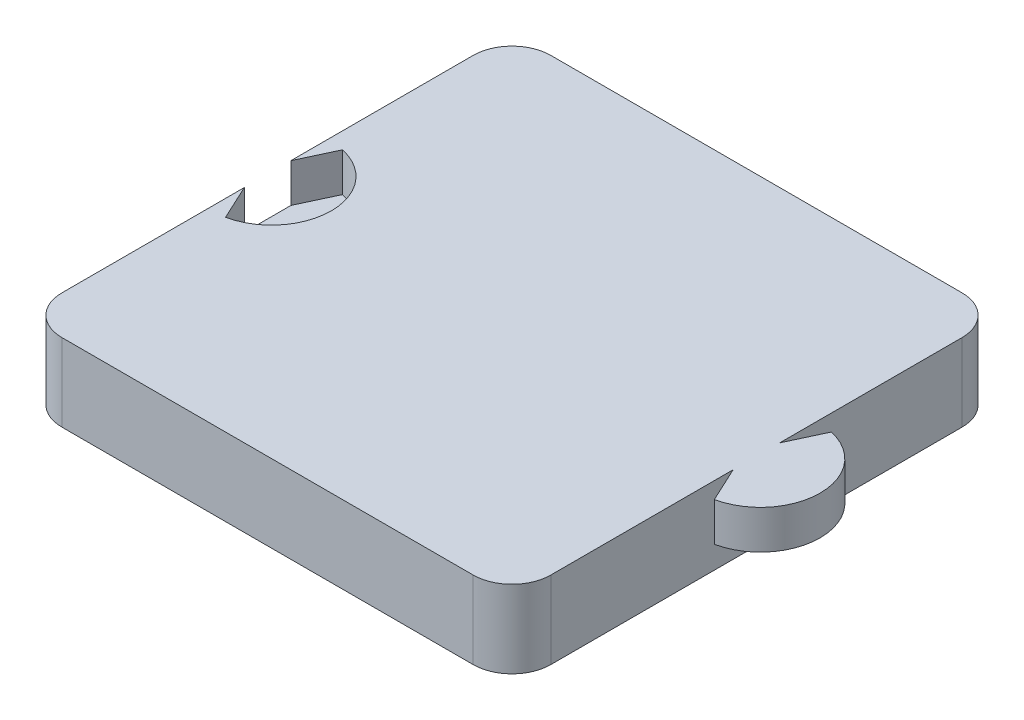
ISO-10303-21;
HEADER;
FILE_DESCRIPTION(('STEP AP214'),'2;1');
FILE_NAME('part.step','',(''),(''),'','','');
FILE_SCHEMA(('AUTOMOTIVE_DESIGN { 1 0 10303 214 1 1 1 1 }'));
ENDSEC;
DATA;
#1=APPLICATION_CONTEXT('core data for automotive mechanical design processes');
#2=APPLICATION_PROTOCOL_DEFINITION('international standard','automotive_design',2000,#1);
#3=PRODUCT_CONTEXT('',#1,'mechanical');
#4=PRODUCT('Part','Part','',(#3));
#5=PRODUCT_RELATED_PRODUCT_CATEGORY('part','',(#4));
#6=PRODUCT_DEFINITION_FORMATION('','',#4);
#7=PRODUCT_DEFINITION_CONTEXT('part definition',#1,'design');
#8=PRODUCT_DEFINITION('design','',#6,#7);
#9=PRODUCT_DEFINITION_SHAPE('','',#8);
#10=(LENGTH_UNIT() NAMED_UNIT(*) SI_UNIT(.MILLI.,.METRE.));
#11=(NAMED_UNIT(*) PLANE_ANGLE_UNIT() SI_UNIT($,.RADIAN.));
#12=(NAMED_UNIT(*) SI_UNIT($,.STERADIAN.) SOLID_ANGLE_UNIT());
#13=UNCERTAINTY_MEASURE_WITH_UNIT(LENGTH_MEASURE(1.E-05),#10,'distance_accuracy_value','');
#14=(GEOMETRIC_REPRESENTATION_CONTEXT(3) GLOBAL_UNCERTAINTY_ASSIGNED_CONTEXT((#13)) GLOBAL_UNIT_ASSIGNED_CONTEXT((#10,
#11,#12)) REPRESENTATION_CONTEXT('',''));
#15=CARTESIAN_POINT('',(0.,0.,0.));
#16=DIRECTION('',(0.,0.,1.));
#17=DIRECTION('',(1.,0.,0.));
#18=AXIS2_PLACEMENT_3D('',#15,#16,#17);
#19=CARTESIAN_POINT('',(-33.655,12.7,-33.655));
#20=DIRECTION('',(0.,-1.,0.));
#21=DIRECTION('',(0.,0.,-1.));
#22=AXIS2_PLACEMENT_3D('',#19,#20,#21);
#23=CYLINDRICAL_SURFACE('',#22,6.35);
#24=CARTESIAN_POINT('',(-33.655,0.,-33.655));
#25=DIRECTION('',(0.,1.,0.));
#26=DIRECTION('',(0.,0.,-1.));
#27=AXIS2_PLACEMENT_3D('',#24,#25,#26);
#28=CIRCLE('',#27,6.35);
#29=CARTESIAN_POINT('',(-33.655,0.,-40.005));
#30=VERTEX_POINT('',#29);
#31=CARTESIAN_POINT('',(-40.005,0.,-33.655));
#32=VERTEX_POINT('',#31);
#33=EDGE_CURVE('E204',#30,#32,#28,.T.);
#34=ORIENTED_EDGE('',*,*,#33,.T.);
#35=DIRECTION('',(0.,-1.,0.));
#36=VECTOR('',#35,1.);
#37=CARTESIAN_POINT('',(-40.005,12.7,-33.655));
#38=LINE('',#37,#36);
#39=CARTESIAN_POINT('',(-40.005,12.7,-33.655));
#40=VERTEX_POINT('',#39);
#41=EDGE_CURVE('E11',#40,#32,#38,.T.);
#42=ORIENTED_EDGE('',*,*,#41,.F.);
#43=CARTESIAN_POINT('',(-33.655,12.7,-33.655));
#44=DIRECTION('',(0.,1.,0.));
#45=DIRECTION('',(0.,0.,-1.));
#46=AXIS2_PLACEMENT_3D('',#43,#44,#45);
#47=CIRCLE('',#46,6.35);
#48=CARTESIAN_POINT('',(-33.655,12.7,-40.005));
#49=VERTEX_POINT('',#48);
#50=EDGE_CURVE('E210',#49,#40,#47,.T.);
#51=ORIENTED_EDGE('',*,*,#50,.F.);
#52=DIRECTION('',(0.,-1.,0.));
#53=VECTOR('',#52,1.);
#54=CARTESIAN_POINT('',(-33.655,12.7,-40.005));
#55=LINE('',#54,#53);
#56=EDGE_CURVE('E232',#49,#30,#55,.T.);
#57=ORIENTED_EDGE('',*,*,#56,.T.);
#58=EDGE_LOOP('',(#34,#42,#51,#57));
#59=FACE_BOUND('',#58,.T.);
#60=ADVANCED_FACE('F33',(#59),#23,.T.);
#61=CARTESIAN_POINT('',(-40.005,12.7,33.655));
#62=DIRECTION('',(1.,0.,0.));
#63=DIRECTION('',(0.,0.,-1.));
#64=AXIS2_PLACEMENT_3D('',#61,#62,#63);
#65=PLANE('',#64);
#66=DIRECTION('',(0.,0.,1.));
#67=VECTOR('',#66,1.);
#68=CARTESIAN_POINT('',(-40.005,6.35,-3.80999999999999));
#69=LINE('',#68,#67);
#70=CARTESIAN_POINT('',(-40.005,6.35,-3.80999999999999));
#71=VERTEX_POINT('',#70);
#72=CARTESIAN_POINT('',(-40.005,6.35,3.80999999999999));
#73=VERTEX_POINT('',#72);
#74=EDGE_CURVE('E183',#71,#73,#69,.T.);
#75=ORIENTED_EDGE('',*,*,#74,.F.);
#76=DIRECTION('',(0.,1.,0.));
#77=VECTOR('',#76,1.);
#78=CARTESIAN_POINT('',(-40.005,6.35,-3.80999999999999));
#79=LINE('',#78,#77);
#80=CARTESIAN_POINT('',(-40.005,12.7,-3.80999999999999));
#81=VERTEX_POINT('',#80);
#82=EDGE_CURVE('E201',#71,#81,#79,.T.);
#83=ORIENTED_EDGE('',*,*,#82,.T.);
#84=DIRECTION('',(0.,0.,1.));
#85=VECTOR('',#84,1.);
#86=CARTESIAN_POINT('',(-40.005,12.7,33.655));
#87=LINE('',#86,#85);
#88=EDGE_CURVE('E215',#40,#81,#87,.T.);
#89=ORIENTED_EDGE('',*,*,#88,.F.);
#90=ORIENTED_EDGE('',*,*,#41,.T.);
#91=DIRECTION('',(0.,0.,1.));
#92=VECTOR('',#91,1.);
#93=CARTESIAN_POINT('',(-40.005,0.,33.655));
#94=LINE('',#93,#92);
#95=CARTESIAN_POINT('',(-40.005,0.,33.655));
#96=VERTEX_POINT('',#95);
#97=EDGE_CURVE('E235',#32,#96,#94,.T.);
#98=ORIENTED_EDGE('',*,*,#97,.T.);
#99=DIRECTION('',(0.,-1.,0.));
#100=VECTOR('',#99,1.);
#101=CARTESIAN_POINT('',(-40.005,12.7,33.655));
#102=LINE('',#101,#100);
#103=CARTESIAN_POINT('',(-40.005,12.7,33.655));
#104=VERTEX_POINT('',#103);
#105=EDGE_CURVE('E40',#104,#96,#102,.T.);
#106=ORIENTED_EDGE('',*,*,#105,.F.);
#107=CARTESIAN_POINT('',(-40.005,12.7,3.80999999999999));
#108=VERTEX_POINT('',#107);
#109=EDGE_CURVE('E213',#108,#104,#87,.T.);
#110=ORIENTED_EDGE('',*,*,#109,.F.);
#111=DIRECTION('',(0.,1.,0.));
#112=VECTOR('',#111,1.);
#113=CARTESIAN_POINT('',(-40.005,6.35,3.80999999999999));
#114=LINE('',#113,#112);
#115=EDGE_CURVE('E55',#73,#108,#114,.T.);
#116=ORIENTED_EDGE('',*,*,#115,.F.);
#117=EDGE_LOOP('',(#75,#83,#89,#90,#98,#106,#110,#116));
#118=FACE_BOUND('',#117,.T.);
#119=ADVANCED_FACE('F291',(#118),#65,.F.);
#120=CARTESIAN_POINT('',(-33.655,12.7,33.655));
#121=DIRECTION('',(0.,-1.,0.));
#122=DIRECTION('',(0.,0.,-1.));
#123=AXIS2_PLACEMENT_3D('',#120,#121,#122);
#124=CYLINDRICAL_SURFACE('',#123,6.35);
#125=CARTESIAN_POINT('',(-33.655,0.,33.655));
#126=DIRECTION('',(0.,1.,0.));
#127=DIRECTION('',(0.,0.,-1.));
#128=AXIS2_PLACEMENT_3D('',#125,#126,#127);
#129=CIRCLE('',#128,6.35);
#130=CARTESIAN_POINT('',(-33.655,0.,40.005));
#131=VERTEX_POINT('',#130);
#132=EDGE_CURVE('E237',#96,#131,#129,.T.);
#133=ORIENTED_EDGE('',*,*,#132,.T.);
#134=DIRECTION('',(0.,-1.,0.));
#135=VECTOR('',#134,1.);
#136=CARTESIAN_POINT('',(-33.655,12.7,40.005));
#137=LINE('',#136,#135);
#138=CARTESIAN_POINT('',(-33.655,12.7,40.005));
#139=VERTEX_POINT('',#138);
#140=EDGE_CURVE('E262',#139,#131,#137,.T.);
#141=ORIENTED_EDGE('',*,*,#140,.F.);
#142=CARTESIAN_POINT('',(-33.655,12.7,33.655));
#143=DIRECTION('',(0.,1.,0.));
#144=DIRECTION('',(0.,0.,-1.));
#145=AXIS2_PLACEMENT_3D('',#142,#143,#144);
#146=CIRCLE('',#145,6.35);
#147=EDGE_CURVE('E218',#104,#139,#146,.T.);
#148=ORIENTED_EDGE('',*,*,#147,.F.);
#149=ORIENTED_EDGE('',*,*,#105,.T.);
#150=EDGE_LOOP('',(#133,#141,#148,#149));
#151=FACE_BOUND('',#150,.T.);
#152=ADVANCED_FACE('F269',(#151),#124,.T.);
#153=CARTESIAN_POINT('',(-33.655,12.7,40.005));
#154=DIRECTION('',(0.,0.,-1.));
#155=DIRECTION('',(-1.,0.,0.));
#156=AXIS2_PLACEMENT_3D('',#153,#154,#155);
#157=PLANE('',#156);
#158=DIRECTION('',(1.,0.,0.));
#159=VECTOR('',#158,1.);
#160=CARTESIAN_POINT('',(-33.655,0.,40.005));
#161=LINE('',#160,#159);
#162=CARTESIAN_POINT('',(33.655,0.,40.005));
#163=VERTEX_POINT('',#162);
#164=EDGE_CURVE('E239',#131,#163,#161,.T.);
#165=ORIENTED_EDGE('',*,*,#164,.T.);
#166=DIRECTION('',(0.,-1.,0.));
#167=VECTOR('',#166,1.);
#168=CARTESIAN_POINT('',(33.655,12.7,40.005));
#169=LINE('',#168,#167);
#170=CARTESIAN_POINT('',(33.655,12.7,40.005));
#171=VERTEX_POINT('',#170);
#172=EDGE_CURVE('E259',#171,#163,#169,.T.);
#173=ORIENTED_EDGE('',*,*,#172,.F.);
#174=DIRECTION('',(1.,0.,0.));
#175=VECTOR('',#174,1.);
#176=CARTESIAN_POINT('',(-33.655,12.7,40.005));
#177=LINE('',#176,#175);
#178=EDGE_CURVE('E220',#139,#171,#177,.T.);
#179=ORIENTED_EDGE('',*,*,#178,.F.);
#180=ORIENTED_EDGE('',*,*,#140,.T.);
#181=EDGE_LOOP('',(#165,#173,#179,#180));
#182=FACE_BOUND('',#181,.T.);
#183=ADVANCED_FACE('F281',(#182),#157,.F.);
#184=CARTESIAN_POINT('',(33.655,12.7,33.655));
#185=DIRECTION('',(0.,-1.,0.));
#186=DIRECTION('',(0.,0.,-1.));
#187=AXIS2_PLACEMENT_3D('',#184,#185,#186);
#188=CYLINDRICAL_SURFACE('',#187,6.35);
#189=CARTESIAN_POINT('',(33.655,0.,33.655));
#190=DIRECTION('',(0.,1.,0.));
#191=DIRECTION('',(0.,0.,1.));
#192=AXIS2_PLACEMENT_3D('',#189,#190,#191);
#193=CIRCLE('',#192,6.35);
#194=CARTESIAN_POINT('',(40.005,0.,33.655));
#195=VERTEX_POINT('',#194);
#196=EDGE_CURVE('E241',#163,#195,#193,.T.);
#197=ORIENTED_EDGE('',*,*,#196,.T.);
#198=DIRECTION('',(0.,-1.,0.));
#199=VECTOR('',#198,1.);
#200=CARTESIAN_POINT('',(40.005,12.7,33.655));
#201=LINE('',#200,#199);
#202=CARTESIAN_POINT('',(40.005,12.7,33.655));
#203=VERTEX_POINT('',#202);
#204=EDGE_CURVE('E256',#203,#195,#201,.T.);
#205=ORIENTED_EDGE('',*,*,#204,.F.);
#206=CARTESIAN_POINT('',(33.655,12.7,33.655));
#207=DIRECTION('',(0.,1.,0.));
#208=DIRECTION('',(0.,0.,1.));
#209=AXIS2_PLACEMENT_3D('',#206,#207,#208);
#210=CIRCLE('',#209,6.35);
#211=EDGE_CURVE('E222',#171,#203,#210,.T.);
#212=ORIENTED_EDGE('',*,*,#211,.F.);
#213=ORIENTED_EDGE('',*,*,#172,.T.);
#214=EDGE_LOOP('',(#197,#205,#212,#213));
#215=FACE_BOUND('',#214,.T.);
#216=ADVANCED_FACE('F285',(#215),#188,.T.);
#217=CARTESIAN_POINT('',(40.005,12.7,33.655));
#218=DIRECTION('',(-1.,0.,0.));
#219=DIRECTION('',(0.,0.,1.));
#220=AXIS2_PLACEMENT_3D('',#217,#218,#219);
#221=PLANE('',#220);
#222=DIRECTION('',(0.,0.,1.));
#223=VECTOR('',#222,1.);
#224=CARTESIAN_POINT('',(40.005,6.35,-3.80999999999999));
#225=LINE('',#224,#223);
#226=CARTESIAN_POINT('',(40.005,6.35,-3.80999999999999));
#227=VERTEX_POINT('',#226);
#228=CARTESIAN_POINT('',(40.005,6.35,3.80999999999999));
#229=VERTEX_POINT('',#228);
#230=EDGE_CURVE('E156',#227,#229,#225,.T.);
#231=ORIENTED_EDGE('',*,*,#230,.T.);
#232=DIRECTION('',(0.,1.,0.));
#233=VECTOR('',#232,1.);
#234=CARTESIAN_POINT('',(40.005,6.35,3.80999999999999));
#235=LINE('',#234,#233);
#236=CARTESIAN_POINT('',(40.005,12.7,3.80999999999999));
#237=VERTEX_POINT('',#236);
#238=EDGE_CURVE('E169',#229,#237,#235,.T.);
#239=ORIENTED_EDGE('',*,*,#238,.T.);
#240=DIRECTION('',(0.,0.,-1.));
#241=VECTOR('',#240,1.);
#242=CARTESIAN_POINT('',(40.005,12.7,33.655));
#243=LINE('',#242,#241);
#244=EDGE_CURVE('E225',#203,#237,#243,.T.);
#245=ORIENTED_EDGE('',*,*,#244,.F.);
#246=ORIENTED_EDGE('',*,*,#204,.T.);
#247=DIRECTION('',(0.,0.,-1.));
#248=VECTOR('',#247,1.);
#249=CARTESIAN_POINT('',(40.005,0.,33.655));
#250=LINE('',#249,#248);
#251=CARTESIAN_POINT('',(40.005,0.,-33.655));
#252=VERTEX_POINT('',#251);
#253=EDGE_CURVE('E243',#195,#252,#250,.T.);
#254=ORIENTED_EDGE('',*,*,#253,.T.);
#255=DIRECTION('',(0.,-1.,0.));
#256=VECTOR('',#255,1.);
#257=CARTESIAN_POINT('',(40.005,12.7,-33.655));
#258=LINE('',#257,#256);
#259=CARTESIAN_POINT('',(40.005,12.7,-33.655));
#260=VERTEX_POINT('',#259);
#261=EDGE_CURVE('E253',#260,#252,#258,.T.);
#262=ORIENTED_EDGE('',*,*,#261,.F.);
#263=CARTESIAN_POINT('',(40.005,12.7,-3.80999999999999));
#264=VERTEX_POINT('',#263);
#265=EDGE_CURVE('E224',#264,#260,#243,.T.);
#266=ORIENTED_EDGE('',*,*,#265,.F.);
#267=DIRECTION('',(0.,1.,0.));
#268=VECTOR('',#267,1.);
#269=CARTESIAN_POINT('',(40.005,6.35,-3.80999999999999));
#270=LINE('',#269,#268);
#271=EDGE_CURVE('E180',#227,#264,#270,.T.);
#272=ORIENTED_EDGE('',*,*,#271,.F.);
#273=EDGE_LOOP('',(#231,#239,#245,#246,#254,#262,#266,#272));
#274=FACE_BOUND('',#273,.T.);
#275=ADVANCED_FACE('F315',(#274),#221,.F.);
#276=CARTESIAN_POINT('',(33.655,12.7,-33.655));
#277=DIRECTION('',(0.,-1.,0.));
#278=DIRECTION('',(0.,0.,-1.));
#279=AXIS2_PLACEMENT_3D('',#276,#277,#278);
#280=CYLINDRICAL_SURFACE('',#279,6.35);
#281=CARTESIAN_POINT('',(33.655,0.,-33.655));
#282=DIRECTION('',(0.,1.,0.));
#283=DIRECTION('',(0.,0.,-1.));
#284=AXIS2_PLACEMENT_3D('',#281,#282,#283);
#285=CIRCLE('',#284,6.35);
#286=CARTESIAN_POINT('',(33.655,0.,-40.005));
#287=VERTEX_POINT('',#286);
#288=EDGE_CURVE('E245',#252,#287,#285,.T.);
#289=ORIENTED_EDGE('',*,*,#288,.T.);
#290=DIRECTION('',(0.,-1.,0.));
#291=VECTOR('',#290,1.);
#292=CARTESIAN_POINT('',(33.655,12.7,-40.005));
#293=LINE('',#292,#291);
#294=CARTESIAN_POINT('',(33.655,12.7,-40.005));
#295=VERTEX_POINT('',#294);
#296=EDGE_CURVE('E250',#295,#287,#293,.T.);
#297=ORIENTED_EDGE('',*,*,#296,.F.);
#298=CARTESIAN_POINT('',(33.655,12.7,-33.655));
#299=DIRECTION('',(0.,1.,0.));
#300=DIRECTION('',(0.,0.,-1.));
#301=AXIS2_PLACEMENT_3D('',#298,#299,#300);
#302=CIRCLE('',#301,6.35);
#303=EDGE_CURVE('E228',#260,#295,#302,.T.);
#304=ORIENTED_EDGE('',*,*,#303,.F.);
#305=ORIENTED_EDGE('',*,*,#261,.T.);
#306=EDGE_LOOP('',(#289,#297,#304,#305));
#307=FACE_BOUND('',#306,.T.);
#308=ADVANCED_FACE('F311',(#307),#280,.T.);
#309=CARTESIAN_POINT('',(-33.655,12.7,-40.005));
#310=DIRECTION('',(0.,0.,1.));
#311=DIRECTION('',(1.,0.,0.));
#312=AXIS2_PLACEMENT_3D('',#309,#310,#311);
#313=PLANE('',#312);
#314=DIRECTION('',(-1.,0.,0.));
#315=VECTOR('',#314,1.);
#316=CARTESIAN_POINT('',(-33.655,0.,-40.005));
#317=LINE('',#316,#315);
#318=EDGE_CURVE('E214',#287,#30,#317,.T.);
#319=ORIENTED_EDGE('',*,*,#318,.T.);
#320=ORIENTED_EDGE('',*,*,#56,.F.);
#321=DIRECTION('',(-1.,0.,0.));
#322=VECTOR('',#321,1.);
#323=CARTESIAN_POINT('',(-33.655,12.7,-40.005));
#324=LINE('',#323,#322);
#325=EDGE_CURVE('E230',#295,#49,#324,.T.);
#326=ORIENTED_EDGE('',*,*,#325,.F.);
#327=ORIENTED_EDGE('',*,*,#296,.T.);
#328=EDGE_LOOP('',(#319,#320,#326,#327));
#329=FACE_BOUND('',#328,.T.);
#330=ADVANCED_FACE('F306',(#329),#313,.F.);
#331=CARTESIAN_POINT('',(-33.655,12.7,-33.655));
#332=DIRECTION('',(0.,-1.,0.));
#333=DIRECTION('',(0.,0.,-1.));
#334=AXIS2_PLACEMENT_3D('',#331,#332,#333);
#335=PLANE('',#334);
#336=ORIENTED_EDGE('',*,*,#88,.T.);
#337=DIRECTION('',(-0.422618261740695,0.,0.906307787036652));
#338=VECTOR('',#337,1.);
#339=CARTESIAN_POINT('',(-40.005,12.7,-3.80999999999999));
#340=LINE('',#339,#338);
#341=CARTESIAN_POINT('',(-37.3213740379466,12.7,-9.56505444768274));
#342=VERTEX_POINT('',#341);
#343=EDGE_CURVE('E187',#342,#81,#340,.T.);
#344=ORIENTED_EDGE('',*,*,#343,.F.);
#345=CARTESIAN_POINT('',(-39.3557226837949,12.7,0.));
#346=DIRECTION('',(0.,1.,0.));
#347=DIRECTION('',(0.,0.,-1.));
#348=AXIS2_PLACEMENT_3D('',#345,#346,#347);
#349=CIRCLE('',#348,9.779);
#350=CARTESIAN_POINT('',(-37.3213740379466,12.7,9.56505444768274));
#351=VERTEX_POINT('',#350);
#352=EDGE_CURVE('E197',#351,#342,#349,.T.);
#353=ORIENTED_EDGE('',*,*,#352,.F.);
#354=DIRECTION('',(0.422618261740695,0.,0.906307787036652));
#355=VECTOR('',#354,1.);
#356=CARTESIAN_POINT('',(-40.005,12.7,3.80999999999999));
#357=LINE('',#356,#355);
#358=EDGE_CURVE('E179',#108,#351,#357,.T.);
#359=ORIENTED_EDGE('',*,*,#358,.F.);
#360=ORIENTED_EDGE('',*,*,#109,.T.);
#361=ORIENTED_EDGE('',*,*,#147,.T.);
#362=ORIENTED_EDGE('',*,*,#178,.T.);
#363=ORIENTED_EDGE('',*,*,#211,.T.);
#364=ORIENTED_EDGE('',*,*,#244,.T.);
#365=DIRECTION('',(0.422618261740695,0.,0.906307787036652));
#366=VECTOR('',#365,1.);
#367=CARTESIAN_POINT('',(40.005,12.7,3.80999999999999));
#368=LINE('',#367,#366);
#369=CARTESIAN_POINT('',(42.6886259620534,12.7,9.56505444768274));
#370=VERTEX_POINT('',#369);
#371=EDGE_CURVE('E175',#237,#370,#368,.T.);
#372=ORIENTED_EDGE('',*,*,#371,.T.);
#373=CARTESIAN_POINT('',(40.6542773162051,12.7,0.));
#374=DIRECTION('',(0.,1.,0.));
#375=DIRECTION('',(0.,0.,1.));
#376=AXIS2_PLACEMENT_3D('',#373,#374,#375);
#377=CIRCLE('',#376,9.779);
#378=CARTESIAN_POINT('',(42.6886259620534,12.7,-9.56505444768274));
#379=VERTEX_POINT('',#378);
#380=EDGE_CURVE('E151',#370,#379,#377,.T.);
#381=ORIENTED_EDGE('',*,*,#380,.T.);
#382=DIRECTION('',(-0.422618261740695,0.,0.906307787036652));
#383=VECTOR('',#382,1.);
#384=CARTESIAN_POINT('',(42.6886259620534,12.7,-9.56505444768274));
#385=LINE('',#384,#383);
#386=EDGE_CURVE('E47',#379,#264,#385,.T.);
#387=ORIENTED_EDGE('',*,*,#386,.T.);
#388=ORIENTED_EDGE('',*,*,#265,.T.);
#389=ORIENTED_EDGE('',*,*,#303,.T.);
#390=ORIENTED_EDGE('',*,*,#325,.T.);
#391=ORIENTED_EDGE('',*,*,#50,.T.);
#392=EDGE_LOOP('',(#336,#344,#353,#359,#360,#361,#362,#363,#364,#372,#381,#387,#388,#389,#390,#391));
#393=FACE_BOUND('',#392,.T.);
#394=ADVANCED_FACE('F288',(#393),#335,.F.);
#395=CARTESIAN_POINT('',(-33.655,0.,-33.655));
#396=DIRECTION('',(0.,-1.,0.));
#397=DIRECTION('',(0.,0.,-1.));
#398=AXIS2_PLACEMENT_3D('',#395,#396,#397);
#399=PLANE('',#398);
#400=ORIENTED_EDGE('',*,*,#33,.F.);
#401=ORIENTED_EDGE('',*,*,#318,.F.);
#402=ORIENTED_EDGE('',*,*,#288,.F.);
#403=ORIENTED_EDGE('',*,*,#253,.F.);
#404=ORIENTED_EDGE('',*,*,#196,.F.);
#405=ORIENTED_EDGE('',*,*,#164,.F.);
#406=ORIENTED_EDGE('',*,*,#132,.F.);
#407=ORIENTED_EDGE('',*,*,#97,.F.);
#408=EDGE_LOOP('',(#400,#401,#402,#403,#404,#405,#406,#407));
#409=FACE_BOUND('',#408,.T.);
#410=ADVANCED_FACE('F276',(#409),#399,.T.);
#411=CARTESIAN_POINT('',(-40.005,6.35,-3.80999999999999));
#412=DIRECTION('',(-0.906307787036652,0.,-0.422618261740695));
#413=DIRECTION('',(-0.422618261740695,0.,0.906307787036652));
#414=AXIS2_PLACEMENT_3D('',#411,#412,#413);
#415=PLANE('',#414);
#416=ORIENTED_EDGE('',*,*,#343,.T.);
#417=ORIENTED_EDGE('',*,*,#82,.F.);
#418=DIRECTION('',(-0.422618261740695,0.,0.906307787036652));
#419=VECTOR('',#418,1.);
#420=CARTESIAN_POINT('',(-40.005,6.35,-3.80999999999999));
#421=LINE('',#420,#419);
#422=CARTESIAN_POINT('',(-37.3213740379466,6.35,-9.56505444768274));
#423=VERTEX_POINT('',#422);
#424=EDGE_CURVE('E193',#423,#71,#421,.T.);
#425=ORIENTED_EDGE('',*,*,#424,.F.);
#426=DIRECTION('',(0.,1.,0.));
#427=VECTOR('',#426,1.);
#428=CARTESIAN_POINT('',(-37.3213740379466,6.35,-9.56505444768274));
#429=LINE('',#428,#427);
#430=EDGE_CURVE('E205',#423,#342,#429,.T.);
#431=ORIENTED_EDGE('',*,*,#430,.T.);
#432=EDGE_LOOP('',(#416,#417,#425,#431));
#433=FACE_BOUND('',#432,.T.);
#434=ADVANCED_FACE('F297',(#433),#415,.F.);
#435=CARTESIAN_POINT('',(-39.3557226837949,6.35,0.));
#436=DIRECTION('',(0.,1.,0.));
#437=DIRECTION('',(0.,0.,1.));
#438=AXIS2_PLACEMENT_3D('',#435,#436,#437);
#439=CYLINDRICAL_SURFACE('',#438,9.779);
#440=ORIENTED_EDGE('',*,*,#352,.T.);
#441=ORIENTED_EDGE('',*,*,#430,.F.);
#442=CARTESIAN_POINT('',(-39.3557226837949,6.35,0.));
#443=DIRECTION('',(0.,1.,0.));
#444=DIRECTION('',(0.,0.,-1.));
#445=AXIS2_PLACEMENT_3D('',#442,#443,#444);
#446=CIRCLE('',#445,9.779);
#447=CARTESIAN_POINT('',(-37.3213740379466,6.35,9.56505444768274));
#448=VERTEX_POINT('',#447);
#449=EDGE_CURVE('E190',#448,#423,#446,.T.);
#450=ORIENTED_EDGE('',*,*,#449,.F.);
#451=DIRECTION('',(0.,1.,0.));
#452=VECTOR('',#451,1.);
#453=CARTESIAN_POINT('',(-37.3213740379466,6.35,9.56505444768274));
#454=LINE('',#453,#452);
#455=EDGE_CURVE('E207',#448,#351,#454,.T.);
#456=ORIENTED_EDGE('',*,*,#455,.T.);
#457=EDGE_LOOP('',(#440,#441,#450,#456));
#458=FACE_BOUND('',#457,.T.);
#459=ADVANCED_FACE('F354',(#458),#439,.F.);
#460=CARTESIAN_POINT('',(-40.005,6.35,3.80999999999999));
#461=DIRECTION('',(-0.906307787036652,0.,0.422618261740695));
#462=DIRECTION('',(0.422618261740695,0.,0.906307787036652));
#463=AXIS2_PLACEMENT_3D('',#460,#461,#462);
#464=PLANE('',#463);
#465=ORIENTED_EDGE('',*,*,#358,.T.);
#466=ORIENTED_EDGE('',*,*,#455,.F.);
#467=DIRECTION('',(0.422618261740695,0.,0.906307787036652));
#468=VECTOR('',#467,1.);
#469=CARTESIAN_POINT('',(-40.005,6.35,3.80999999999999));
#470=LINE('',#469,#468);
#471=EDGE_CURVE('E186',#73,#448,#470,.T.);
#472=ORIENTED_EDGE('',*,*,#471,.F.);
#473=ORIENTED_EDGE('',*,*,#115,.T.);
#474=EDGE_LOOP('',(#465,#466,#472,#473));
#475=FACE_BOUND('',#474,.T.);
#476=ADVANCED_FACE('F351',(#475),#464,.F.);
#477=CARTESIAN_POINT('',(-39.3557226837949,6.35,0.));
#478=DIRECTION('',(0.,-1.,0.));
#479=DIRECTION('',(0.,0.,-1.));
#480=AXIS2_PLACEMENT_3D('',#477,#478,#479);
#481=PLANE('',#480);
#482=ORIENTED_EDGE('',*,*,#74,.T.);
#483=ORIENTED_EDGE('',*,*,#471,.T.);
#484=ORIENTED_EDGE('',*,*,#449,.T.);
#485=ORIENTED_EDGE('',*,*,#424,.T.);
#486=EDGE_LOOP('',(#482,#483,#484,#485));
#487=FACE_BOUND('',#486,.T.);
#488=ADVANCED_FACE('F293',(#487),#481,.F.);
#489=CARTESIAN_POINT('',(40.005,6.35,3.80999999999999));
#490=DIRECTION('',(-0.906307787036652,0.,0.422618261740695));
#491=DIRECTION('',(0.422618261740695,0.,0.906307787036652));
#492=AXIS2_PLACEMENT_3D('',#489,#490,#491);
#493=PLANE('',#492);
#494=ORIENTED_EDGE('',*,*,#371,.F.);
#495=ORIENTED_EDGE('',*,*,#238,.F.);
#496=DIRECTION('',(0.422618261740695,0.,0.906307787036652));
#497=VECTOR('',#496,1.);
#498=CARTESIAN_POINT('',(40.005,6.35,3.80999999999999));
#499=LINE('',#498,#497);
#500=CARTESIAN_POINT('',(42.6886259620534,6.35,9.56505444768274));
#501=VERTEX_POINT('',#500);
#502=EDGE_CURVE('E163',#229,#501,#499,.T.);
#503=ORIENTED_EDGE('',*,*,#502,.T.);
#504=DIRECTION('',(0.,1.,0.));
#505=VECTOR('',#504,1.);
#506=CARTESIAN_POINT('',(42.6886259620534,6.35,9.56505444768274));
#507=LINE('',#506,#505);
#508=EDGE_CURVE('E147',#501,#370,#507,.T.);
#509=ORIENTED_EDGE('',*,*,#508,.T.);
#510=EDGE_LOOP('',(#494,#495,#503,#509));
#511=FACE_BOUND('',#510,.T.);
#512=ADVANCED_FACE('F167',(#511),#493,.T.);
#513=CARTESIAN_POINT('',(42.6886259620534,6.35,-9.56505444768274));
#514=DIRECTION('',(-0.906307787036652,0.,-0.422618261740695));
#515=DIRECTION('',(-0.422618261740695,0.,0.906307787036652));
#516=AXIS2_PLACEMENT_3D('',#513,#514,#515);
#517=PLANE('',#516);
#518=ORIENTED_EDGE('',*,*,#386,.F.);
#519=DIRECTION('',(0.,1.,0.));
#520=VECTOR('',#519,1.);
#521=CARTESIAN_POINT('',(42.6886259620534,6.35,-9.56505444768274));
#522=LINE('',#521,#520);
#523=CARTESIAN_POINT('',(42.6886259620534,6.35,-9.56505444768274));
#524=VERTEX_POINT('',#523);
#525=EDGE_CURVE('E155',#524,#379,#522,.T.);
#526=ORIENTED_EDGE('',*,*,#525,.F.);
#527=DIRECTION('',(-0.422618261740695,0.,0.906307787036652));
#528=VECTOR('',#527,1.);
#529=CARTESIAN_POINT('',(42.6886259620534,6.35,-9.56505444768274));
#530=LINE('',#529,#528);
#531=EDGE_CURVE('E165',#524,#227,#530,.T.);
#532=ORIENTED_EDGE('',*,*,#531,.T.);
#533=ORIENTED_EDGE('',*,*,#271,.T.);
#534=EDGE_LOOP('',(#518,#526,#532,#533));
#535=FACE_BOUND('',#534,.T.);
#536=ADVANCED_FACE('F318',(#535),#517,.T.);
#537=CARTESIAN_POINT('',(40.6542773162051,6.35,0.));
#538=DIRECTION('',(0.,1.,0.));
#539=DIRECTION('',(0.,0.,1.));
#540=AXIS2_PLACEMENT_3D('',#537,#538,#539);
#541=CYLINDRICAL_SURFACE('',#540,9.779);
#542=ORIENTED_EDGE('',*,*,#380,.F.);
#543=ORIENTED_EDGE('',*,*,#508,.F.);
#544=CARTESIAN_POINT('',(40.6542773162051,6.35,0.));
#545=DIRECTION('',(0.,1.,0.));
#546=DIRECTION('',(0.,0.,1.));
#547=AXIS2_PLACEMENT_3D('',#544,#545,#546);
#548=CIRCLE('',#547,9.779);
#549=EDGE_CURVE('E150',#501,#524,#548,.T.);
#550=ORIENTED_EDGE('',*,*,#549,.T.);
#551=ORIENTED_EDGE('',*,*,#525,.T.);
#552=EDGE_LOOP('',(#542,#543,#550,#551));
#553=FACE_BOUND('',#552,.T.);
#554=ADVANCED_FACE('F149',(#553),#541,.T.);
#555=CARTESIAN_POINT('',(40.6542773162051,6.35,0.));
#556=DIRECTION('',(0.,1.,0.));
#557=DIRECTION('',(0.,0.,1.));
#558=AXIS2_PLACEMENT_3D('',#555,#556,#557);
#559=PLANE('',#558);
#560=ORIENTED_EDGE('',*,*,#502,.F.);
#561=ORIENTED_EDGE('',*,*,#230,.F.);
#562=ORIENTED_EDGE('',*,*,#531,.F.);
#563=ORIENTED_EDGE('',*,*,#549,.F.);
#564=EDGE_LOOP('',(#560,#561,#562,#563));
#565=FACE_BOUND('',#564,.T.);
#566=ADVANCED_FACE('F161',(#565),#559,.F.);
#567=CLOSED_SHELL('',(#60,#119,#152,#183,#216,#275,#308,#330,#394,#410,#434,#459,#476,#488,#512,
#536,#554,#566));
#568=MANIFOLD_SOLID_BREP('B2',#567);
#569=ADVANCED_BREP_SHAPE_REPRESENTATION('',(#18,#568),#14);
#570=SHAPE_DEFINITION_REPRESENTATION(#9,#569);
ENDSEC;
END-ISO-10303-21;
